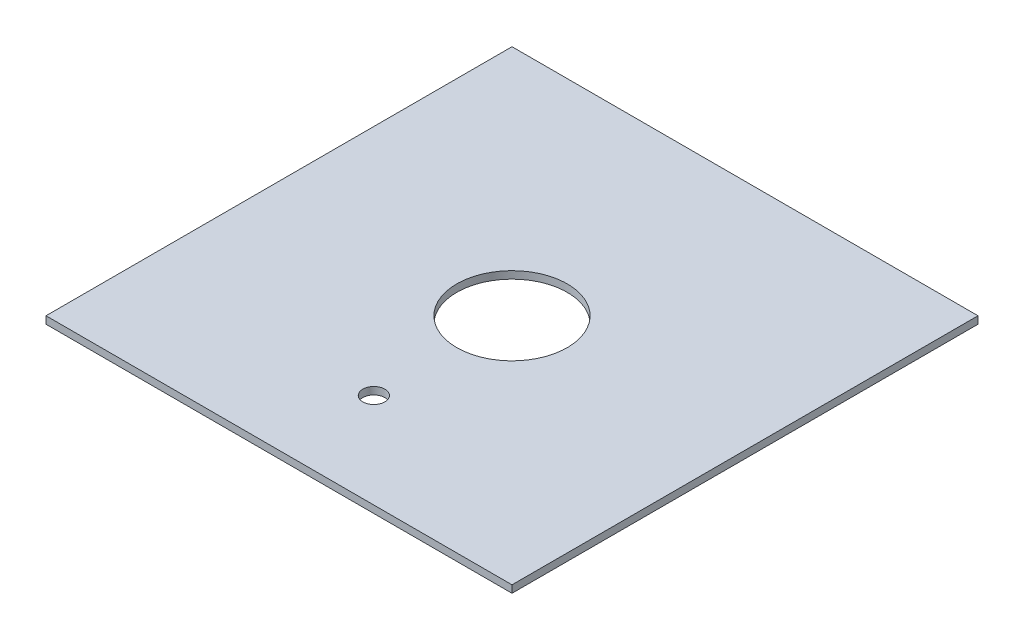
ISO-10303-21;
HEADER;
FILE_DESCRIPTION(('STEP AP214'),'2;1');
FILE_NAME('part.step','',(''),(''),'','','');
FILE_SCHEMA(('AUTOMOTIVE_DESIGN { 1 0 10303 214 1 1 1 1 }'));
ENDSEC;
DATA;
#1=APPLICATION_CONTEXT('core data for automotive mechanical design processes');
#2=APPLICATION_PROTOCOL_DEFINITION('international standard','automotive_design',2000,#1);
#3=PRODUCT_CONTEXT('',#1,'mechanical');
#4=PRODUCT('Part','Part','',(#3));
#5=PRODUCT_RELATED_PRODUCT_CATEGORY('part','',(#4));
#6=PRODUCT_DEFINITION_FORMATION('','',#4);
#7=PRODUCT_DEFINITION_CONTEXT('part definition',#1,'design');
#8=PRODUCT_DEFINITION('design','',#6,#7);
#9=PRODUCT_DEFINITION_SHAPE('','',#8);
#10=(LENGTH_UNIT() NAMED_UNIT(*) SI_UNIT(.MILLI.,.METRE.));
#11=(NAMED_UNIT(*) PLANE_ANGLE_UNIT() SI_UNIT($,.RADIAN.));
#12=(NAMED_UNIT(*) SI_UNIT($,.STERADIAN.) SOLID_ANGLE_UNIT());
#13=UNCERTAINTY_MEASURE_WITH_UNIT(LENGTH_MEASURE(1.E-05),#10,'distance_accuracy_value','');
#14=(GEOMETRIC_REPRESENTATION_CONTEXT(3) GLOBAL_UNCERTAINTY_ASSIGNED_CONTEXT((#13)) GLOBAL_UNIT_ASSIGNED_CONTEXT((#10,
#11,#12)) REPRESENTATION_CONTEXT('',''));
#15=CARTESIAN_POINT('',(0.,0.,0.));
#16=DIRECTION('',(0.,0.,1.));
#17=DIRECTION('',(1.,0.,0.));
#18=AXIS2_PLACEMENT_3D('',#15,#16,#17);
#19=CARTESIAN_POINT('',(-126.5,4.,-126.5));
#20=DIRECTION('',(1.,0.,0.));
#21=DIRECTION('',(0.,0.,-1.));
#22=AXIS2_PLACEMENT_3D('',#19,#20,#21);
#23=PLANE('',#22);
#24=DIRECTION('',(0.,0.,1.));
#25=VECTOR('',#24,1.);
#26=CARTESIAN_POINT('',(-126.5,0.,-126.5));
#27=LINE('',#26,#25);
#28=CARTESIAN_POINT('',(-126.5,0.,-126.5));
#29=VERTEX_POINT('',#28);
#30=CARTESIAN_POINT('',(-126.5,0.,126.5));
#31=VERTEX_POINT('',#30);
#32=EDGE_CURVE('E109',#29,#31,#27,.T.);
#33=ORIENTED_EDGE('',*,*,#32,.T.);
#34=DIRECTION('',(0.,-1.,0.));
#35=VECTOR('',#34,1.);
#36=CARTESIAN_POINT('',(-126.5,4.,126.5));
#37=LINE('',#36,#35);
#38=CARTESIAN_POINT('',(-126.5,4.,126.5));
#39=VERTEX_POINT('',#38);
#40=EDGE_CURVE('E11',#39,#31,#37,.T.);
#41=ORIENTED_EDGE('',*,*,#40,.F.);
#42=DIRECTION('',(0.,0.,1.));
#43=VECTOR('',#42,1.);
#44=CARTESIAN_POINT('',(-126.5,4.,-126.5));
#45=LINE('',#44,#43);
#46=CARTESIAN_POINT('',(-126.5,4.,-126.5));
#47=VERTEX_POINT('',#46);
#48=EDGE_CURVE('E93',#47,#39,#45,.T.);
#49=ORIENTED_EDGE('',*,*,#48,.F.);
#50=DIRECTION('',(0.,-1.,0.));
#51=VECTOR('',#50,1.);
#52=CARTESIAN_POINT('',(-126.5,4.,-126.5));
#53=LINE('',#52,#51);
#54=EDGE_CURVE('E105',#47,#29,#53,.T.);
#55=ORIENTED_EDGE('',*,*,#54,.T.);
#56=EDGE_LOOP('',(#33,#41,#49,#55));
#57=FACE_BOUND('',#56,.T.);
#58=ADVANCED_FACE('F41',(#57),#23,.F.);
#59=CARTESIAN_POINT('',(126.5,4.,126.5));
#60=DIRECTION('',(0.,0.,-1.));
#61=DIRECTION('',(-1.,0.,0.));
#62=AXIS2_PLACEMENT_3D('',#59,#60,#61);
#63=PLANE('',#62);
#64=DIRECTION('',(1.,0.,0.));
#65=VECTOR('',#64,1.);
#66=CARTESIAN_POINT('',(126.5,0.,126.5));
#67=LINE('',#66,#65);
#68=CARTESIAN_POINT('',(126.5,0.,126.5));
#69=VERTEX_POINT('',#68);
#70=EDGE_CURVE('E98',#31,#69,#67,.T.);
#71=ORIENTED_EDGE('',*,*,#70,.T.);
#72=DIRECTION('',(0.,-1.,0.));
#73=VECTOR('',#72,1.);
#74=CARTESIAN_POINT('',(126.5,4.,126.5));
#75=LINE('',#74,#73);
#76=CARTESIAN_POINT('',(126.5,4.,126.5));
#77=VERTEX_POINT('',#76);
#78=EDGE_CURVE('E50',#77,#69,#75,.T.);
#79=ORIENTED_EDGE('',*,*,#78,.F.);
#80=DIRECTION('',(1.,0.,0.));
#81=VECTOR('',#80,1.);
#82=CARTESIAN_POINT('',(126.5,4.,126.5));
#83=LINE('',#82,#81);
#84=EDGE_CURVE('E88',#39,#77,#83,.T.);
#85=ORIENTED_EDGE('',*,*,#84,.F.);
#86=ORIENTED_EDGE('',*,*,#40,.T.);
#87=EDGE_LOOP('',(#71,#79,#85,#86));
#88=FACE_BOUND('',#87,.T.);
#89=ADVANCED_FACE('F97',(#88),#63,.F.);
#90=CARTESIAN_POINT('',(126.5,4.,-126.5));
#91=DIRECTION('',(-1.,0.,0.));
#92=DIRECTION('',(0.,0.,1.));
#93=AXIS2_PLACEMENT_3D('',#90,#91,#92);
#94=PLANE('',#93);
#95=DIRECTION('',(0.,0.,-1.));
#96=VECTOR('',#95,1.);
#97=CARTESIAN_POINT('',(126.5,0.,-126.5));
#98=LINE('',#97,#96);
#99=CARTESIAN_POINT('',(126.5,0.,-126.5));
#100=VERTEX_POINT('',#99);
#101=EDGE_CURVE('E75',#69,#100,#98,.T.);
#102=ORIENTED_EDGE('',*,*,#101,.T.);
#103=DIRECTION('',(0.,-1.,0.));
#104=VECTOR('',#103,1.);
#105=CARTESIAN_POINT('',(126.5,4.,-126.5));
#106=LINE('',#105,#104);
#107=CARTESIAN_POINT('',(126.5,4.,-126.5));
#108=VERTEX_POINT('',#107);
#109=EDGE_CURVE('E100',#108,#100,#106,.T.);
#110=ORIENTED_EDGE('',*,*,#109,.F.);
#111=DIRECTION('',(0.,0.,-1.));
#112=VECTOR('',#111,1.);
#113=CARTESIAN_POINT('',(126.5,4.,-126.5));
#114=LINE('',#113,#112);
#115=EDGE_CURVE('E91',#77,#108,#114,.T.);
#116=ORIENTED_EDGE('',*,*,#115,.F.);
#117=ORIENTED_EDGE('',*,*,#78,.T.);
#118=EDGE_LOOP('',(#102,#110,#116,#117));
#119=FACE_BOUND('',#118,.T.);
#120=ADVANCED_FACE('F101',(#119),#94,.F.);
#121=CARTESIAN_POINT('',(126.5,4.,-126.5));
#122=DIRECTION('',(0.,0.,1.));
#123=DIRECTION('',(1.,0.,0.));
#124=AXIS2_PLACEMENT_3D('',#121,#122,#123);
#125=PLANE('',#124);
#126=DIRECTION('',(-1.,0.,0.));
#127=VECTOR('',#126,1.);
#128=CARTESIAN_POINT('',(126.5,0.,-126.5));
#129=LINE('',#128,#127);
#130=EDGE_CURVE('E81',#100,#29,#129,.T.);
#131=ORIENTED_EDGE('',*,*,#130,.T.);
#132=ORIENTED_EDGE('',*,*,#54,.F.);
#133=DIRECTION('',(-1.,0.,0.));
#134=VECTOR('',#133,1.);
#135=CARTESIAN_POINT('',(126.5,4.,-126.5));
#136=LINE('',#135,#134);
#137=EDGE_CURVE('E58',#108,#47,#136,.T.);
#138=ORIENTED_EDGE('',*,*,#137,.F.);
#139=ORIENTED_EDGE('',*,*,#109,.T.);
#140=EDGE_LOOP('',(#131,#132,#138,#139));
#141=FACE_BOUND('',#140,.T.);
#142=ADVANCED_FACE('F123',(#141),#125,.F.);
#143=CARTESIAN_POINT('',(0.,4.,0.));
#144=DIRECTION('',(0.,-1.,0.));
#145=DIRECTION('',(0.,0.,-1.));
#146=AXIS2_PLACEMENT_3D('',#143,#144,#145);
#147=PLANE('',#146);
#148=CARTESIAN_POINT('',(0.,4.,75.));
#149=DIRECTION('',(0.,1.,0.));
#150=DIRECTION('',(0.,0.,1.));
#151=AXIS2_PLACEMENT_3D('',#148,#149,#150);
#152=CIRCLE('',#151,6.);
#153=CARTESIAN_POINT('',(0.,4.,81.));
#154=VERTEX_POINT('',#153);
#155=EDGE_CURVE('E138',#154,#154,#152,.T.);
#156=ORIENTED_EDGE('',*,*,#155,.F.);
#157=EDGE_LOOP('',(#156));
#158=FACE_BOUND('',#157,.T.);
#159=CARTESIAN_POINT('',(0.,4.,0.));
#160=DIRECTION('',(0.,1.,0.));
#161=DIRECTION('',(0.,0.,1.));
#162=AXIS2_PLACEMENT_3D('',#159,#160,#161);
#163=CIRCLE('',#162,30.);
#164=CARTESIAN_POINT('',(0.,4.,30.));
#165=VERTEX_POINT('',#164);
#166=EDGE_CURVE('E130',#165,#165,#163,.T.);
#167=ORIENTED_EDGE('',*,*,#166,.F.);
#168=EDGE_LOOP('',(#167));
#169=FACE_BOUND('',#168,.T.);
#170=ORIENTED_EDGE('',*,*,#48,.T.);
#171=ORIENTED_EDGE('',*,*,#84,.T.);
#172=ORIENTED_EDGE('',*,*,#115,.T.);
#173=ORIENTED_EDGE('',*,*,#137,.T.);
#174=EDGE_LOOP('',(#170,#171,#172,#173));
#175=FACE_BOUND('',#174,.T.);
#176=ADVANCED_FACE('F89',(#158,#169,#175),#147,.F.);
#177=CARTESIAN_POINT('',(0.,0.,0.));
#178=DIRECTION('',(0.,-1.,0.));
#179=DIRECTION('',(0.,0.,-1.));
#180=AXIS2_PLACEMENT_3D('',#177,#178,#179);
#181=PLANE('',#180);
#182=CARTESIAN_POINT('',(0.,0.,75.));
#183=DIRECTION('',(0.,1.,0.));
#184=DIRECTION('',(0.,0.,1.));
#185=AXIS2_PLACEMENT_3D('',#182,#183,#184);
#186=CIRCLE('',#185,6.);
#187=CARTESIAN_POINT('',(0.,0.,81.));
#188=VERTEX_POINT('',#187);
#189=EDGE_CURVE('E113',#188,#188,#186,.T.);
#190=ORIENTED_EDGE('',*,*,#189,.T.);
#191=EDGE_LOOP('',(#190));
#192=FACE_BOUND('',#191,.T.);
#193=CARTESIAN_POINT('',(0.,0.,0.));
#194=DIRECTION('',(0.,1.,0.));
#195=DIRECTION('',(0.,0.,1.));
#196=AXIS2_PLACEMENT_3D('',#193,#194,#195);
#197=CIRCLE('',#196,30.);
#198=CARTESIAN_POINT('',(0.,0.,30.));
#199=VERTEX_POINT('',#198);
#200=EDGE_CURVE('E134',#199,#199,#197,.T.);
#201=ORIENTED_EDGE('',*,*,#200,.T.);
#202=EDGE_LOOP('',(#201));
#203=FACE_BOUND('',#202,.T.);
#204=ORIENTED_EDGE('',*,*,#32,.F.);
#205=ORIENTED_EDGE('',*,*,#130,.F.);
#206=ORIENTED_EDGE('',*,*,#101,.F.);
#207=ORIENTED_EDGE('',*,*,#70,.F.);
#208=EDGE_LOOP('',(#204,#205,#206,#207));
#209=FACE_BOUND('',#208,.T.);
#210=ADVANCED_FACE('F126',(#192,#203,#209),#181,.T.);
#211=CARTESIAN_POINT('',(0.,0.,0.));
#212=DIRECTION('',(0.,1.,0.));
#213=DIRECTION('',(0.,0.,1.));
#214=AXIS2_PLACEMENT_3D('',#211,#212,#213);
#215=CYLINDRICAL_SURFACE('',#214,30.);
#216=ORIENTED_EDGE('',*,*,#200,.F.);
#217=EDGE_LOOP('',(#216));
#218=FACE_BOUND('',#217,.T.);
#219=ORIENTED_EDGE('',*,*,#166,.T.);
#220=EDGE_LOOP('',(#219));
#221=FACE_BOUND('',#220,.T.);
#222=ADVANCED_FACE('F151',(#218,#221),#215,.F.);
#223=CARTESIAN_POINT('',(0.,0.,75.));
#224=DIRECTION('',(0.,1.,0.));
#225=DIRECTION('',(0.,0.,1.));
#226=AXIS2_PLACEMENT_3D('',#223,#224,#225);
#227=CYLINDRICAL_SURFACE('',#226,6.);
#228=ORIENTED_EDGE('',*,*,#189,.F.);
#229=EDGE_LOOP('',(#228));
#230=FACE_BOUND('',#229,.T.);
#231=ORIENTED_EDGE('',*,*,#155,.T.);
#232=EDGE_LOOP('',(#231));
#233=FACE_BOUND('',#232,.T.);
#234=ADVANCED_FACE('F148',(#230,#233),#227,.F.);
#235=CLOSED_SHELL('',(#58,#89,#120,#142,#176,#210,#222,#234));
#236=MANIFOLD_SOLID_BREP('B2',#235);
#237=ADVANCED_BREP_SHAPE_REPRESENTATION('',(#18,#236),#14);
#238=SHAPE_DEFINITION_REPRESENTATION(#9,#237);
ENDSEC;
END-ISO-10303-21;
